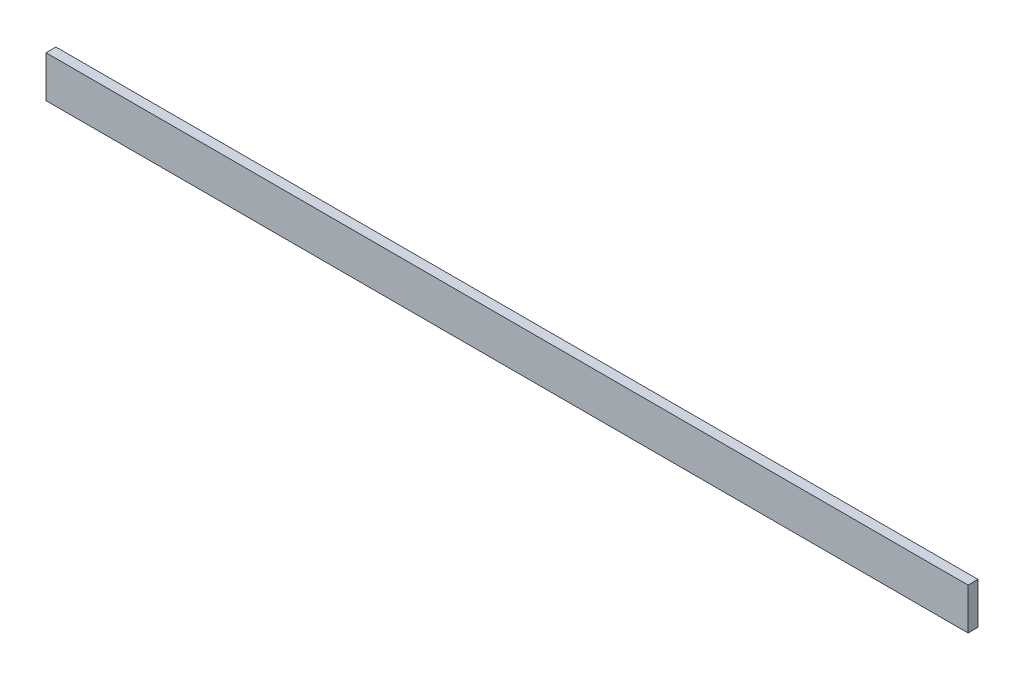
ISO-10303-21;
HEADER;
FILE_DESCRIPTION(('STEP AP214'),'2;1');
FILE_NAME('part.step','',(''),(''),'','','');
FILE_SCHEMA(('AUTOMOTIVE_DESIGN { 1 0 10303 214 1 1 1 1 }'));
ENDSEC;
DATA;
#1=APPLICATION_CONTEXT('core data for automotive mechanical design processes');
#2=APPLICATION_PROTOCOL_DEFINITION('international standard','automotive_design',2000,#1);
#3=PRODUCT_CONTEXT('',#1,'mechanical');
#4=PRODUCT('Part','Part','',(#3));
#5=PRODUCT_RELATED_PRODUCT_CATEGORY('part','',(#4));
#6=PRODUCT_DEFINITION_FORMATION('','',#4);
#7=PRODUCT_DEFINITION_CONTEXT('part definition',#1,'design');
#8=PRODUCT_DEFINITION('design','',#6,#7);
#9=PRODUCT_DEFINITION_SHAPE('','',#8);
#10=(LENGTH_UNIT() NAMED_UNIT(*) SI_UNIT(.MILLI.,.METRE.));
#11=(NAMED_UNIT(*) PLANE_ANGLE_UNIT() SI_UNIT($,.RADIAN.));
#12=(NAMED_UNIT(*) SI_UNIT($,.STERADIAN.) SOLID_ANGLE_UNIT());
#13=UNCERTAINTY_MEASURE_WITH_UNIT(LENGTH_MEASURE(1.E-05),#10,'distance_accuracy_value','');
#14=(GEOMETRIC_REPRESENTATION_CONTEXT(3) GLOBAL_UNCERTAINTY_ASSIGNED_CONTEXT((#13)) GLOBAL_UNIT_ASSIGNED_CONTEXT((#10,
#11,#12)) REPRESENTATION_CONTEXT('',''));
#15=CARTESIAN_POINT('',(0.,0.,0.));
#16=DIRECTION('',(0.,0.,1.));
#17=DIRECTION('',(1.,0.,0.));
#18=AXIS2_PLACEMENT_3D('',#15,#16,#17);
#19=CARTESIAN_POINT('',(-0.01,0.,-0.01));
#20=DIRECTION('',(0.,-1.,0.));
#21=DIRECTION('',(1.,0.,0.));
#22=AXIS2_PLACEMENT_3D('',#19,#20,#21);
#23=PLANE('',#22);
#24=DIRECTION('',(1.,0.,0.));
#25=VECTOR('',#24,1.);
#26=CARTESIAN_POINT('',(1022.,0.,22.));
#27=LINE('',#26,#25);
#28=CARTESIAN_POINT('',(0.,0.,22.));
#29=VERTEX_POINT('',#28);
#30=CARTESIAN_POINT('',(2044.,0.,22.));
#31=VERTEX_POINT('',#30);
#32=EDGE_CURVE('E69',#29,#31,#27,.T.);
#33=ORIENTED_EDGE('',*,*,#32,.F.);
#34=DIRECTION('',(0.,0.,1.));
#35=VECTOR('',#34,1.);
#36=CARTESIAN_POINT('',(0.,0.,11.));
#37=LINE('',#36,#35);
#38=CARTESIAN_POINT('',(0.,0.,0.));
#39=VERTEX_POINT('',#38);
#40=EDGE_CURVE('E56',#39,#29,#37,.T.);
#41=ORIENTED_EDGE('',*,*,#40,.F.);
#42=DIRECTION('',(-1.,0.,0.));
#43=VECTOR('',#42,1.);
#44=CARTESIAN_POINT('',(1022.,0.,0.));
#45=LINE('',#44,#43);
#46=CARTESIAN_POINT('',(2044.,0.,0.));
#47=VERTEX_POINT('',#46);
#48=EDGE_CURVE('E21',#47,#39,#45,.T.);
#49=ORIENTED_EDGE('',*,*,#48,.F.);
#50=DIRECTION('',(0.,0.,-1.));
#51=VECTOR('',#50,1.);
#52=CARTESIAN_POINT('',(2044.,0.,11.));
#53=LINE('',#52,#51);
#54=EDGE_CURVE('E82',#31,#47,#53,.T.);
#55=ORIENTED_EDGE('',*,*,#54,.F.);
#56=EDGE_LOOP('',(#33,#41,#49,#55));
#57=FACE_BOUND('',#56,.T.);
#58=ADVANCED_FACE('F17',(#57),#23,.T.);
#59=CARTESIAN_POINT('',(2044.01,-0.0100000000000033,0.));
#60=DIRECTION('',(0.,0.,-1.));
#61=DIRECTION('',(-1.,0.,0.));
#62=AXIS2_PLACEMENT_3D('',#59,#60,#61);
#63=PLANE('',#62);
#64=DIRECTION('',(0.,1.,0.));
#65=VECTOR('',#64,1.);
#66=CARTESIAN_POINT('',(2044.,46.,0.));
#67=LINE('',#66,#65);
#68=CARTESIAN_POINT('',(2044.,92.,0.));
#69=VERTEX_POINT('',#68);
#70=EDGE_CURVE('E65',#47,#69,#67,.T.);
#71=ORIENTED_EDGE('',*,*,#70,.F.);
#72=ORIENTED_EDGE('',*,*,#48,.T.);
#73=DIRECTION('',(0.,-1.,0.));
#74=VECTOR('',#73,1.);
#75=CARTESIAN_POINT('',(0.,46.,0.));
#76=LINE('',#75,#74);
#77=CARTESIAN_POINT('',(0.,92.,0.));
#78=VERTEX_POINT('',#77);
#79=EDGE_CURVE('E62',#78,#39,#76,.T.);
#80=ORIENTED_EDGE('',*,*,#79,.F.);
#81=DIRECTION('',(-1.,0.,0.));
#82=VECTOR('',#81,1.);
#83=CARTESIAN_POINT('',(1022.,92.,0.));
#84=LINE('',#83,#82);
#85=EDGE_CURVE('E84',#69,#78,#84,.T.);
#86=ORIENTED_EDGE('',*,*,#85,.F.);
#87=EDGE_LOOP('',(#71,#72,#80,#86));
#88=FACE_BOUND('',#87,.T.);
#89=ADVANCED_FACE('F61',(#88),#63,.T.);
#90=CARTESIAN_POINT('',(0.,92.01,-0.01));
#91=DIRECTION('',(-1.,0.,0.));
#92=DIRECTION('',(0.,-1.,0.));
#93=AXIS2_PLACEMENT_3D('',#90,#91,#92);
#94=PLANE('',#93);
#95=DIRECTION('',(0.,-1.,0.));
#96=VECTOR('',#95,1.);
#97=CARTESIAN_POINT('',(0.,46.,22.));
#98=LINE('',#97,#96);
#99=CARTESIAN_POINT('',(0.,92.,22.));
#100=VERTEX_POINT('',#99);
#101=EDGE_CURVE('E71',#100,#29,#98,.T.);
#102=ORIENTED_EDGE('',*,*,#101,.F.);
#103=DIRECTION('',(0.,0.,1.));
#104=VECTOR('',#103,1.);
#105=CARTESIAN_POINT('',(-1.11459371463299E-13,92.,11.));
#106=LINE('',#105,#104);
#107=EDGE_CURVE('E75',#78,#100,#106,.T.);
#108=ORIENTED_EDGE('',*,*,#107,.F.);
#109=ORIENTED_EDGE('',*,*,#79,.T.);
#110=ORIENTED_EDGE('',*,*,#40,.T.);
#111=EDGE_LOOP('',(#102,#108,#109,#110));
#112=FACE_BOUND('',#111,.T.);
#113=ADVANCED_FACE('F73',(#112),#94,.T.);
#114=CARTESIAN_POINT('',(-0.0100000000000477,-0.0100000000000033,22.));
#115=DIRECTION('',(0.,0.,1.));
#116=DIRECTION('',(1.,0.,0.));
#117=AXIS2_PLACEMENT_3D('',#114,#115,#116);
#118=PLANE('',#117);
#119=DIRECTION('',(0.,-1.,0.));
#120=VECTOR('',#119,1.);
#121=CARTESIAN_POINT('',(2044.,46.,22.));
#122=LINE('',#121,#120);
#123=CARTESIAN_POINT('',(2044.,92.,22.));
#124=VERTEX_POINT('',#123);
#125=EDGE_CURVE('E36',#124,#31,#122,.T.);
#126=ORIENTED_EDGE('',*,*,#125,.F.);
#127=DIRECTION('',(1.,0.,0.));
#128=VECTOR('',#127,1.);
#129=CARTESIAN_POINT('',(1022.,92.,22.));
#130=LINE('',#129,#128);
#131=EDGE_CURVE('E27',#100,#124,#130,.T.);
#132=ORIENTED_EDGE('',*,*,#131,.F.);
#133=ORIENTED_EDGE('',*,*,#101,.T.);
#134=ORIENTED_EDGE('',*,*,#32,.T.);
#135=EDGE_LOOP('',(#126,#132,#133,#134));
#136=FACE_BOUND('',#135,.T.);
#137=ADVANCED_FACE('F89',(#136),#118,.T.);
#138=CARTESIAN_POINT('',(2044.,-0.01,-0.01));
#139=DIRECTION('',(1.,0.,0.));
#140=DIRECTION('',(0.,1.,0.));
#141=AXIS2_PLACEMENT_3D('',#138,#139,#140);
#142=PLANE('',#141);
#143=ORIENTED_EDGE('',*,*,#125,.T.);
#144=ORIENTED_EDGE('',*,*,#54,.T.);
#145=ORIENTED_EDGE('',*,*,#70,.T.);
#146=DIRECTION('',(0.,0.,-1.));
#147=VECTOR('',#146,1.);
#148=CARTESIAN_POINT('',(2044.,92.,11.));
#149=LINE('',#148,#147);
#150=EDGE_CURVE('E11',#124,#69,#149,.T.);
#151=ORIENTED_EDGE('',*,*,#150,.F.);
#152=EDGE_LOOP('',(#143,#144,#145,#151));
#153=FACE_BOUND('',#152,.T.);
#154=ADVANCED_FACE('F91',(#153),#142,.T.);
#155=CARTESIAN_POINT('',(2044.01,92.,-0.01));
#156=DIRECTION('',(0.,1.,0.));
#157=DIRECTION('',(-1.,0.,0.));
#158=AXIS2_PLACEMENT_3D('',#155,#156,#157);
#159=PLANE('',#158);
#160=ORIENTED_EDGE('',*,*,#131,.T.);
#161=ORIENTED_EDGE('',*,*,#150,.T.);
#162=ORIENTED_EDGE('',*,*,#85,.T.);
#163=ORIENTED_EDGE('',*,*,#107,.T.);
#164=EDGE_LOOP('',(#160,#161,#162,#163));
#165=FACE_BOUND('',#164,.T.);
#166=ADVANCED_FACE('F19',(#165),#159,.T.);
#167=CLOSED_SHELL('',(#58,#89,#113,#137,#154,#166));
#168=MANIFOLD_SOLID_BREP('B1',#167);
#169=ADVANCED_BREP_SHAPE_REPRESENTATION('',(#18,#168),#14);
#170=SHAPE_DEFINITION_REPRESENTATION(#9,#169);
ENDSEC;
END-ISO-10303-21;
